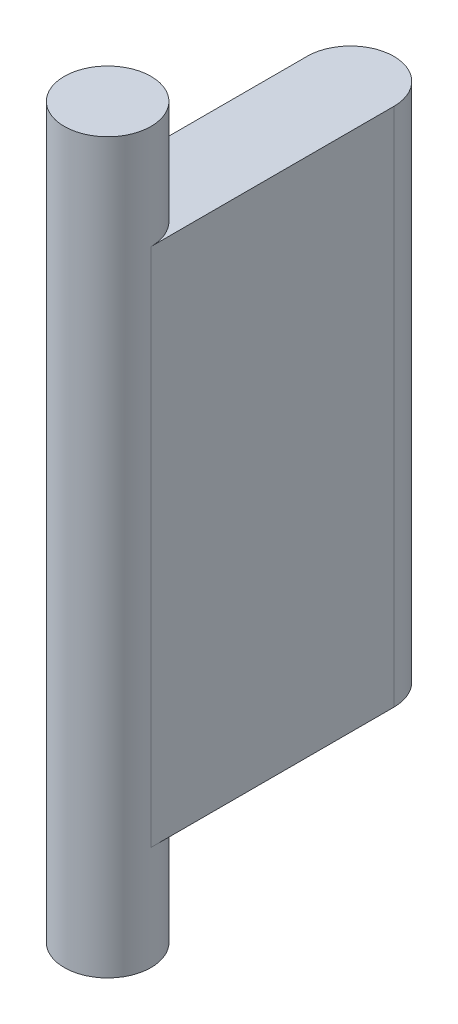
ISO-10303-21;
HEADER;
FILE_DESCRIPTION(('STEP AP214'),'2;1');
FILE_NAME('part.step','',(''),(''),'','','');
FILE_SCHEMA(('AUTOMOTIVE_DESIGN { 1 0 10303 214 1 1 1 1 }'));
ENDSEC;
DATA;
#1=APPLICATION_CONTEXT('core data for automotive mechanical design processes');
#2=APPLICATION_PROTOCOL_DEFINITION('international standard','automotive_design',2000,#1);
#3=PRODUCT_CONTEXT('',#1,'mechanical');
#4=PRODUCT('Part','Part','',(#3));
#5=PRODUCT_RELATED_PRODUCT_CATEGORY('part','',(#4));
#6=PRODUCT_DEFINITION_FORMATION('','',#4);
#7=PRODUCT_DEFINITION_CONTEXT('part definition',#1,'design');
#8=PRODUCT_DEFINITION('design','',#6,#7);
#9=PRODUCT_DEFINITION_SHAPE('','',#8);
#10=(LENGTH_UNIT() NAMED_UNIT(*) SI_UNIT(.MILLI.,.METRE.));
#11=(NAMED_UNIT(*) PLANE_ANGLE_UNIT() SI_UNIT($,.RADIAN.));
#12=(NAMED_UNIT(*) SI_UNIT($,.STERADIAN.) SOLID_ANGLE_UNIT());
#13=UNCERTAINTY_MEASURE_WITH_UNIT(LENGTH_MEASURE(1.E-05),#10,'distance_accuracy_value','');
#14=(GEOMETRIC_REPRESENTATION_CONTEXT(3) GLOBAL_UNCERTAINTY_ASSIGNED_CONTEXT((#13)) GLOBAL_UNIT_ASSIGNED_CONTEXT((#10,
#11,#12)) REPRESENTATION_CONTEXT('',''));
#15=CARTESIAN_POINT('',(0.,0.,0.));
#16=DIRECTION('',(0.,0.,1.));
#17=DIRECTION('',(1.,0.,0.));
#18=AXIS2_PLACEMENT_3D('',#15,#16,#17);
#19=CARTESIAN_POINT('',(0.,15.,0.));
#20=DIRECTION('',(0.,-1.,0.));
#21=DIRECTION('',(0.,0.,-1.));
#22=AXIS2_PLACEMENT_3D('',#19,#20,#21);
#23=CYLINDRICAL_SURFACE('',#22,1.25);
#24=DIRECTION('',(0.,-1.,0.));
#25=VECTOR('',#24,1.);
#26=CARTESIAN_POINT('',(-1.25,15.,0.));
#27=LINE('',#26,#25);
#28=CARTESIAN_POINT('',(-1.25,15.,0.));
#29=VERTEX_POINT('',#28);
#30=CARTESIAN_POINT('',(-1.25,0.,0.));
#31=VERTEX_POINT('',#30);
#32=EDGE_CURVE('E95',#29,#31,#27,.T.);
#33=ORIENTED_EDGE('',*,*,#32,.T.);
#34=CARTESIAN_POINT('',(0.,0.,0.));
#35=DIRECTION('',(0.,-1.,0.));
#36=DIRECTION('',(0.,0.,-1.));
#37=AXIS2_PLACEMENT_3D('',#34,#35,#36);
#38=CIRCLE('',#37,1.25);
#39=CARTESIAN_POINT('',(1.25,0.,0.));
#40=VERTEX_POINT('',#39);
#41=EDGE_CURVE('E11',#31,#40,#38,.T.);
#42=ORIENTED_EDGE('',*,*,#41,.T.);
#43=DIRECTION('',(0.,-1.,0.));
#44=VECTOR('',#43,1.);
#45=CARTESIAN_POINT('',(1.25,15.,0.));
#46=LINE('',#45,#44);
#47=CARTESIAN_POINT('',(1.25,15.,0.));
#48=VERTEX_POINT('',#47);
#49=EDGE_CURVE('E39',#48,#40,#46,.T.);
#50=ORIENTED_EDGE('',*,*,#49,.F.);
#51=CARTESIAN_POINT('',(0.,15.,0.));
#52=DIRECTION('',(0.,1.,0.));
#53=DIRECTION('',(0.,0.,1.));
#54=AXIS2_PLACEMENT_3D('',#51,#52,#53);
#55=CIRCLE('',#54,1.25);
#56=EDGE_CURVE('E96',#48,#29,#55,.T.);
#57=ORIENTED_EDGE('',*,*,#56,.T.);
#58=EDGE_LOOP('',(#33,#42,#50,#57));
#59=FACE_BOUND('',#58,.T.);
#60=CARTESIAN_POINT('',(0.,18.,0.));
#61=DIRECTION('',(0.,1.,0.));
#62=DIRECTION('',(0.,0.,1.));
#63=AXIS2_PLACEMENT_3D('',#60,#61,#62);
#64=CIRCLE('',#63,1.25);
#65=CARTESIAN_POINT('',(0.,18.,1.25));
#66=VERTEX_POINT('',#65);
#67=EDGE_CURVE('E91',#66,#66,#64,.T.);
#68=ORIENTED_EDGE('',*,*,#67,.F.);
#69=EDGE_LOOP('',(#68));
#70=FACE_BOUND('',#69,.T.);
#71=CARTESIAN_POINT('',(0.,-3.,0.));
#72=DIRECTION('',(0.,-1.,0.));
#73=DIRECTION('',(0.,0.,-1.));
#74=AXIS2_PLACEMENT_3D('',#71,#72,#73);
#75=CIRCLE('',#74,1.25);
#76=CARTESIAN_POINT('',(0.,-3.,-1.25));
#77=VERTEX_POINT('',#76);
#78=EDGE_CURVE('E180',#77,#77,#75,.T.);
#79=ORIENTED_EDGE('',*,*,#78,.F.);
#80=EDGE_LOOP('',(#79));
#81=FACE_BOUND('',#80,.T.);
#82=ADVANCED_FACE('F36',(#59,#70,#81),#23,.T.);
#83=CARTESIAN_POINT('',(1.25,15.,0.));
#84=DIRECTION('',(-1.,0.,0.));
#85=DIRECTION('',(0.,0.,1.));
#86=AXIS2_PLACEMENT_3D('',#83,#84,#85);
#87=PLANE('',#86);
#88=DIRECTION('',(0.,0.,-1.));
#89=VECTOR('',#88,1.);
#90=CARTESIAN_POINT('',(1.25,0.,0.));
#91=LINE('',#90,#89);
#92=CARTESIAN_POINT('',(1.25,0.,-7.));
#93=VERTEX_POINT('',#92);
#94=EDGE_CURVE('E86',#40,#93,#91,.T.);
#95=ORIENTED_EDGE('',*,*,#94,.T.);
#96=DIRECTION('',(0.,-1.,0.));
#97=VECTOR('',#96,1.);
#98=CARTESIAN_POINT('',(1.25,15.,-7.));
#99=LINE('',#98,#97);
#100=CARTESIAN_POINT('',(1.25,15.,-7.));
#101=VERTEX_POINT('',#100);
#102=EDGE_CURVE('E89',#101,#93,#99,.T.);
#103=ORIENTED_EDGE('',*,*,#102,.F.);
#104=DIRECTION('',(0.,0.,-1.));
#105=VECTOR('',#104,1.);
#106=CARTESIAN_POINT('',(1.25,15.,0.));
#107=LINE('',#106,#105);
#108=EDGE_CURVE('E77',#48,#101,#107,.T.);
#109=ORIENTED_EDGE('',*,*,#108,.F.);
#110=ORIENTED_EDGE('',*,*,#49,.T.);
#111=EDGE_LOOP('',(#95,#103,#109,#110));
#112=FACE_BOUND('',#111,.T.);
#113=ADVANCED_FACE('F85',(#112),#87,.F.);
#114=CARTESIAN_POINT('',(0.,15.,-7.));
#115=DIRECTION('',(0.,-1.,0.));
#116=DIRECTION('',(0.,0.,-1.));
#117=AXIS2_PLACEMENT_3D('',#114,#115,#116);
#118=CYLINDRICAL_SURFACE('',#117,1.25);
#119=CARTESIAN_POINT('',(0.,0.,-7.));
#120=DIRECTION('',(0.,1.,0.));
#121=DIRECTION('',(0.,0.,1.));
#122=AXIS2_PLACEMENT_3D('',#119,#120,#121);
#123=CIRCLE('',#122,1.25);
#124=CARTESIAN_POINT('',(-1.25,0.,-7.));
#125=VERTEX_POINT('',#124);
#126=EDGE_CURVE('E68',#93,#125,#123,.T.);
#127=ORIENTED_EDGE('',*,*,#126,.T.);
#128=DIRECTION('',(0.,-1.,0.));
#129=VECTOR('',#128,1.);
#130=CARTESIAN_POINT('',(-1.25,15.,-7.));
#131=LINE('',#130,#129);
#132=CARTESIAN_POINT('',(-1.25,15.,-7.));
#133=VERTEX_POINT('',#132);
#134=EDGE_CURVE('E98',#133,#125,#131,.T.);
#135=ORIENTED_EDGE('',*,*,#134,.F.);
#136=CARTESIAN_POINT('',(0.,15.,-7.));
#137=DIRECTION('',(0.,1.,0.));
#138=DIRECTION('',(0.,0.,1.));
#139=AXIS2_PLACEMENT_3D('',#136,#137,#138);
#140=CIRCLE('',#139,1.25);
#141=EDGE_CURVE('E101',#101,#133,#140,.T.);
#142=ORIENTED_EDGE('',*,*,#141,.F.);
#143=ORIENTED_EDGE('',*,*,#102,.T.);
#144=EDGE_LOOP('',(#127,#135,#142,#143));
#145=FACE_BOUND('',#144,.T.);
#146=ADVANCED_FACE('F107',(#145),#118,.T.);
#147=CARTESIAN_POINT('',(-1.25,15.,0.));
#148=DIRECTION('',(1.,0.,0.));
#149=DIRECTION('',(0.,0.,-1.));
#150=AXIS2_PLACEMENT_3D('',#147,#148,#149);
#151=PLANE('',#150);
#152=DIRECTION('',(0.,0.,1.));
#153=VECTOR('',#152,1.);
#154=CARTESIAN_POINT('',(-1.25,0.,0.));
#155=LINE('',#154,#153);
#156=EDGE_CURVE('E104',#125,#31,#155,.T.);
#157=ORIENTED_EDGE('',*,*,#156,.T.);
#158=ORIENTED_EDGE('',*,*,#32,.F.);
#159=DIRECTION('',(0.,0.,1.));
#160=VECTOR('',#159,1.);
#161=CARTESIAN_POINT('',(-1.25,15.,0.));
#162=LINE('',#161,#160);
#163=EDGE_CURVE('E53',#133,#29,#162,.T.);
#164=ORIENTED_EDGE('',*,*,#163,.F.);
#165=ORIENTED_EDGE('',*,*,#134,.T.);
#166=EDGE_LOOP('',(#157,#158,#164,#165));
#167=FACE_BOUND('',#166,.T.);
#168=ADVANCED_FACE('F111',(#167),#151,.F.);
#169=CARTESIAN_POINT('',(0.,15.,0.));
#170=DIRECTION('',(0.,1.,0.));
#171=DIRECTION('',(0.,0.,1.));
#172=AXIS2_PLACEMENT_3D('',#169,#170,#171);
#173=PLANE('',#172);
#174=ORIENTED_EDGE('',*,*,#56,.F.);
#175=ORIENTED_EDGE('',*,*,#108,.T.);
#176=ORIENTED_EDGE('',*,*,#141,.T.);
#177=ORIENTED_EDGE('',*,*,#163,.T.);
#178=EDGE_LOOP('',(#174,#175,#176,#177));
#179=FACE_BOUND('',#178,.T.);
#180=ADVANCED_FACE('F113',(#179),#173,.T.);
#181=CARTESIAN_POINT('',(0.,0.,0.));
#182=DIRECTION('',(0.,1.,0.));
#183=DIRECTION('',(0.,0.,1.));
#184=AXIS2_PLACEMENT_3D('',#181,#182,#183);
#185=PLANE('',#184);
#186=ORIENTED_EDGE('',*,*,#41,.F.);
#187=ORIENTED_EDGE('',*,*,#156,.F.);
#188=ORIENTED_EDGE('',*,*,#126,.F.);
#189=ORIENTED_EDGE('',*,*,#94,.F.);
#190=EDGE_LOOP('',(#186,#187,#188,#189));
#191=FACE_BOUND('',#190,.T.);
#192=ADVANCED_FACE('F90',(#191),#185,.F.);
#193=CARTESIAN_POINT('',(0.,18.,0.));
#194=DIRECTION('',(0.,1.,0.));
#195=DIRECTION('',(0.,0.,1.));
#196=AXIS2_PLACEMENT_3D('',#193,#194,#195);
#197=PLANE('',#196);
#198=ORIENTED_EDGE('',*,*,#67,.T.);
#199=EDGE_LOOP('',(#198));
#200=FACE_BOUND('',#199,.T.);
#201=ADVANCED_FACE('F146',(#200),#197,.T.);
#202=CARTESIAN_POINT('',(0.,-3.,0.));
#203=DIRECTION('',(0.,-1.,0.));
#204=DIRECTION('',(0.,0.,-1.));
#205=AXIS2_PLACEMENT_3D('',#202,#203,#204);
#206=PLANE('',#205);
#207=ORIENTED_EDGE('',*,*,#78,.T.);
#208=EDGE_LOOP('',(#207));
#209=FACE_BOUND('',#208,.T.);
#210=ADVANCED_FACE('F150',(#209),#206,.T.);
#211=CLOSED_SHELL('',(#82,#113,#146,#168,#180,#192,#201,#210));
#212=MANIFOLD_SOLID_BREP('B2',#211);
#213=ADVANCED_BREP_SHAPE_REPRESENTATION('',(#18,#212),#14);
#214=SHAPE_DEFINITION_REPRESENTATION(#9,#213);
ENDSEC;
END-ISO-10303-21;
